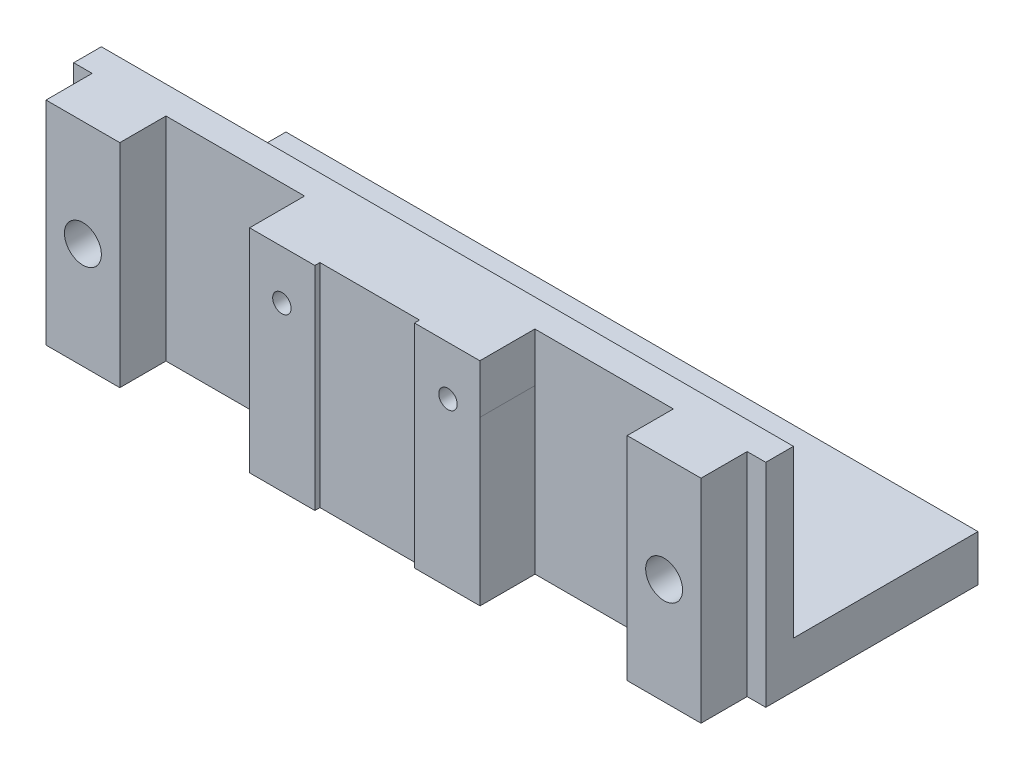
ISO-10303-21;
HEADER;
FILE_DESCRIPTION(('STEP AP214'),'2;1');
FILE_NAME('part.step','',(''),(''),'','','');
FILE_SCHEMA(('AUTOMOTIVE_DESIGN { 1 0 10303 214 1 1 1 1 }'));
ENDSEC;
DATA;
#1=APPLICATION_CONTEXT('core data for automotive mechanical design processes');
#2=APPLICATION_PROTOCOL_DEFINITION('international standard','automotive_design',2000,#1);
#3=PRODUCT_CONTEXT('',#1,'mechanical');
#4=PRODUCT('Part','Part','',(#3));
#5=PRODUCT_RELATED_PRODUCT_CATEGORY('part','',(#4));
#6=PRODUCT_DEFINITION_FORMATION('','',#4);
#7=PRODUCT_DEFINITION_CONTEXT('part definition',#1,'design');
#8=PRODUCT_DEFINITION('design','',#6,#7);
#9=PRODUCT_DEFINITION_SHAPE('','',#8);
#10=(LENGTH_UNIT() NAMED_UNIT(*) SI_UNIT(.MILLI.,.METRE.));
#11=(NAMED_UNIT(*) PLANE_ANGLE_UNIT() SI_UNIT($,.RADIAN.));
#12=(NAMED_UNIT(*) SI_UNIT($,.STERADIAN.) SOLID_ANGLE_UNIT());
#13=UNCERTAINTY_MEASURE_WITH_UNIT(LENGTH_MEASURE(1.E-05),#10,'distance_accuracy_value','');
#14=(GEOMETRIC_REPRESENTATION_CONTEXT(3) GLOBAL_UNCERTAINTY_ASSIGNED_CONTEXT((#13)) GLOBAL_UNIT_ASSIGNED_CONTEXT((#10,
#11,#12)) REPRESENTATION_CONTEXT('',''));
#15=CARTESIAN_POINT('',(0.,0.,0.));
#16=DIRECTION('',(0.,0.,1.));
#17=DIRECTION('',(1.,0.,0.));
#18=AXIS2_PLACEMENT_3D('',#15,#16,#17);
#19=CARTESIAN_POINT('',(-25.,23.,8.5));
#20=DIRECTION('',(0.,0.,1.));
#21=DIRECTION('',(1.,0.,0.));
#22=AXIS2_PLACEMENT_3D('',#19,#20,#21);
#23=PLANE('',#22);
#24=CARTESIAN_POINT('',(-19.,11.5,8.5));
#25=DIRECTION('',(0.,0.,1.));
#26=DIRECTION('',(1.,0.,0.));
#27=AXIS2_PLACEMENT_3D('',#24,#25,#26);
#28=CIRCLE('',#27,2.);
#29=CARTESIAN_POINT('',(-17.,11.5,8.5));
#30=VERTEX_POINT('',#29);
#31=EDGE_CURVE('E506',#30,#30,#28,.T.);
#32=ORIENTED_EDGE('',*,*,#31,.T.);
#33=EDGE_LOOP('',(#32));
#34=FACE_BOUND('',#33,.T.);
#35=CARTESIAN_POINT('',(3.5227918511615,17.6839423341899,8.5));
#36=DIRECTION('',(0.,0.,1.));
#37=DIRECTION('',(1.,0.,0.));
#38=AXIS2_PLACEMENT_3D('',#35,#36,#37);
#39=CIRCLE('',#38,1.);
#40=CARTESIAN_POINT('',(4.5227918511615,17.6839423341899,8.5));
#41=VERTEX_POINT('',#40);
#42=EDGE_CURVE('E255',#41,#41,#39,.T.);
#43=ORIENTED_EDGE('',*,*,#42,.T.);
#44=EDGE_LOOP('',(#43));
#45=FACE_BOUND('',#44,.T.);
#46=CARTESIAN_POINT('',(21.5227918511615,17.6839423341899,8.5));
#47=DIRECTION('',(0.,0.,1.));
#48=DIRECTION('',(1.,0.,0.));
#49=AXIS2_PLACEMENT_3D('',#46,#47,#48);
#50=CIRCLE('',#49,1.);
#51=CARTESIAN_POINT('',(22.5227918511615,17.6839423341899,8.5));
#52=VERTEX_POINT('',#51);
#53=EDGE_CURVE('E251',#52,#52,#50,.T.);
#54=ORIENTED_EDGE('',*,*,#53,.T.);
#55=EDGE_LOOP('',(#54));
#56=FACE_BOUND('',#55,.T.);
#57=DIRECTION('',(0.,1.,0.));
#58=VECTOR('',#57,1.);
#59=CARTESIAN_POINT('',(50.,23.,8.5));
#60=LINE('',#59,#58);
#61=CARTESIAN_POINT('',(50.,5.,8.5));
#62=VERTEX_POINT('',#61);
#63=CARTESIAN_POINT('',(50.,23.,8.5));
#64=VERTEX_POINT('',#63);
#65=EDGE_CURVE('E227',#62,#64,#60,.T.);
#66=ORIENTED_EDGE('',*,*,#65,.F.);
#67=DIRECTION('',(1.,0.,0.));
#68=VECTOR('',#67,1.);
#69=CARTESIAN_POINT('',(-25.,5.,8.5));
#70=LINE('',#69,#68);
#71=CARTESIAN_POINT('',(-25.,5.,8.5));
#72=VERTEX_POINT('',#71);
#73=EDGE_CURVE('E213',#72,#62,#70,.T.);
#74=ORIENTED_EDGE('',*,*,#73,.F.);
#75=DIRECTION('',(0.,-1.,0.));
#76=VECTOR('',#75,1.);
#77=CARTESIAN_POINT('',(-25.,23.,8.5));
#78=LINE('',#77,#76);
#79=CARTESIAN_POINT('',(-25.,23.,8.5));
#80=VERTEX_POINT('',#79);
#81=EDGE_CURVE('E225',#80,#72,#78,.T.);
#82=ORIENTED_EDGE('',*,*,#81,.F.);
#83=DIRECTION('',(-1.,0.,0.));
#84=VECTOR('',#83,1.);
#85=CARTESIAN_POINT('',(-25.,23.,8.5));
#86=LINE('',#85,#84);
#87=EDGE_CURVE('E234',#64,#80,#86,.T.);
#88=ORIENTED_EDGE('',*,*,#87,.F.);
#89=EDGE_LOOP('',(#66,#74,#82,#88));
#90=FACE_BOUND('',#89,.T.);
#91=CARTESIAN_POINT('',(43.9847080927789,11.4972593518539,8.5));
#92=DIRECTION('',(0.,0.,1.));
#93=DIRECTION('',(1.,0.,0.));
#94=AXIS2_PLACEMENT_3D('',#91,#92,#93);
#95=CIRCLE('',#94,2.00000000000001);
#96=CARTESIAN_POINT('',(45.9847080927789,11.4972593518539,8.5));
#97=VERTEX_POINT('',#96);
#98=EDGE_CURVE('E485',#97,#97,#95,.F.);
#99=ORIENTED_EDGE('',*,*,#98,.F.);
#100=EDGE_LOOP('',(#99));
#101=FACE_BOUND('',#100,.T.);
#102=ADVANCED_FACE('F45',(#34,#45,#56,#90,#101),#23,.F.);
#103=CARTESIAN_POINT('',(0.,0.,0.));
#104=DIRECTION('',(0.,-1.,0.));
#105=DIRECTION('',(0.,0.,-1.));
#106=AXIS2_PLACEMENT_3D('',#103,#104,#105);
#107=PLANE('',#106);
#108=CARTESIAN_POINT('',(12.5,0.,-1.06931177623776));
#109=DIRECTION('',(0.,-1.,0.));
#110=DIRECTION('',(0.,0.,-1.));
#111=AXIS2_PLACEMENT_3D('',#108,#109,#110);
#112=CIRCLE('',#111,4.);
#113=CARTESIAN_POINT('',(12.5,0.,-5.06931177623776));
#114=VERTEX_POINT('',#113);
#115=EDGE_CURVE('E492',#114,#114,#112,.T.);
#116=ORIENTED_EDGE('',*,*,#115,.F.);
#117=EDGE_LOOP('',(#116));
#118=FACE_BOUND('',#117,.T.);
#119=DIRECTION('',(0.,0.,-1.));
#120=VECTOR('',#119,1.);
#121=CARTESIAN_POINT('',(17.8908476144119,0.,16.909013180129));
#122=LINE('',#121,#120);
#123=CARTESIAN_POINT('',(17.8908476144119,0.,17.46));
#124=VERTEX_POINT('',#123);
#125=CARTESIAN_POINT('',(17.8908476144119,0.,16.909013180129));
#126=VERTEX_POINT('',#125);
#127=EDGE_CURVE('E411',#124,#126,#122,.T.);
#128=ORIENTED_EDGE('',*,*,#127,.T.);
#129=DIRECTION('',(-1.,0.,0.));
#130=VECTOR('',#129,1.);
#131=CARTESIAN_POINT('',(15.8928598006247,0.,16.9090131801291));
#132=LINE('',#131,#130);
#133=CARTESIAN_POINT('',(7.09285980061332,0.,16.909013180129));
#134=VERTEX_POINT('',#133);
#135=EDGE_CURVE('E419',#126,#134,#132,.T.);
#136=ORIENTED_EDGE('',*,*,#135,.T.);
#137=DIRECTION('',(0.,0.,1.));
#138=VECTOR('',#137,1.);
#139=CARTESIAN_POINT('',(7.09285980061332,0.,16.909013180129));
#140=LINE('',#139,#138);
#141=CARTESIAN_POINT('',(7.09285980061332,0.,17.46));
#142=VERTEX_POINT('',#141);
#143=EDGE_CURVE('E425',#134,#142,#140,.T.);
#144=ORIENTED_EDGE('',*,*,#143,.T.);
#145=DIRECTION('',(1.,0.,0.));
#146=VECTOR('',#145,1.);
#147=CARTESIAN_POINT('',(0.,0.,17.46));
#148=LINE('',#147,#146);
#149=CARTESIAN_POINT('',(0.,0.,17.46));
#150=VERTEX_POINT('',#149);
#151=EDGE_CURVE('E399',#150,#142,#148,.T.);
#152=ORIENTED_EDGE('',*,*,#151,.F.);
#153=DIRECTION('',(0.,0.,-1.));
#154=VECTOR('',#153,1.);
#155=CARTESIAN_POINT('',(0.,0.,17.46));
#156=LINE('',#155,#154);
#157=CARTESIAN_POINT('',(0.,0.,11.5));
#158=VERTEX_POINT('',#157);
#159=EDGE_CURVE('E362',#150,#158,#156,.T.);
#160=ORIENTED_EDGE('',*,*,#159,.T.);
#161=DIRECTION('',(1.,0.,0.));
#162=VECTOR('',#161,1.);
#163=CARTESIAN_POINT('',(-25.,0.,11.5));
#164=LINE('',#163,#162);
#165=CARTESIAN_POINT('',(-15.,0.,11.5));
#166=VERTEX_POINT('',#165);
#167=EDGE_CURVE('E247',#166,#158,#164,.T.);
#168=ORIENTED_EDGE('',*,*,#167,.F.);
#169=DIRECTION('',(0.,0.,-1.));
#170=VECTOR('',#169,1.);
#171=CARTESIAN_POINT('',(-15.,0.,16.5));
#172=LINE('',#171,#170);
#173=CARTESIAN_POINT('',(-15.,0.,16.5));
#174=VERTEX_POINT('',#173);
#175=EDGE_CURVE('E463',#174,#166,#172,.T.);
#176=ORIENTED_EDGE('',*,*,#175,.F.);
#177=DIRECTION('',(1.,0.,0.));
#178=VECTOR('',#177,1.);
#179=CARTESIAN_POINT('',(-23.,0.,16.5));
#180=LINE('',#179,#178);
#181=CARTESIAN_POINT('',(-23.,0.,16.5));
#182=VERTEX_POINT('',#181);
#183=EDGE_CURVE('E472',#182,#174,#180,.T.);
#184=ORIENTED_EDGE('',*,*,#183,.F.);
#185=DIRECTION('',(0.,0.,-1.));
#186=VECTOR('',#185,1.);
#187=CARTESIAN_POINT('',(-23.,0.,16.5));
#188=LINE('',#187,#186);
#189=CARTESIAN_POINT('',(-23.,0.,11.5));
#190=VERTEX_POINT('',#189);
#191=EDGE_CURVE('E334',#182,#190,#188,.T.);
#192=ORIENTED_EDGE('',*,*,#191,.T.);
#193=CARTESIAN_POINT('',(-25.,0.,11.5));
#194=VERTEX_POINT('',#193);
#195=EDGE_CURVE('E244',#194,#190,#164,.T.);
#196=ORIENTED_EDGE('',*,*,#195,.F.);
#197=DIRECTION('',(0.,0.,1.));
#198=VECTOR('',#197,1.);
#199=CARTESIAN_POINT('',(-25.,0.,11.5));
#200=LINE('',#199,#198);
#201=CARTESIAN_POINT('',(-25.,0.,-11.5));
#202=VERTEX_POINT('',#201);
#203=EDGE_CURVE('E236',#202,#194,#200,.T.);
#204=ORIENTED_EDGE('',*,*,#203,.F.);
#205=DIRECTION('',(-1.,0.,0.));
#206=VECTOR('',#205,1.);
#207=CARTESIAN_POINT('',(-25.,0.,-11.5));
#208=LINE('',#207,#206);
#209=CARTESIAN_POINT('',(50.,0.,-11.5));
#210=VERTEX_POINT('',#209);
#211=EDGE_CURVE('E233',#210,#202,#208,.T.);
#212=ORIENTED_EDGE('',*,*,#211,.F.);
#213=DIRECTION('',(0.,0.,-1.));
#214=VECTOR('',#213,1.);
#215=CARTESIAN_POINT('',(50.,0.,-11.5));
#216=LINE('',#215,#214);
#217=CARTESIAN_POINT('',(50.,0.,11.5));
#218=VERTEX_POINT('',#217);
#219=EDGE_CURVE('E354',#218,#210,#216,.T.);
#220=ORIENTED_EDGE('',*,*,#219,.F.);
#221=CARTESIAN_POINT('',(47.9837074150253,0.,11.5));
#222=VERTEX_POINT('',#221);
#223=EDGE_CURVE('E243',#222,#218,#164,.T.);
#224=ORIENTED_EDGE('',*,*,#223,.F.);
#225=DIRECTION('',(0.,0.,-1.));
#226=VECTOR('',#225,1.);
#227=CARTESIAN_POINT('',(47.9837074150253,0.,16.5));
#228=LINE('',#227,#226);
#229=CARTESIAN_POINT('',(47.9837074150253,0.,16.5));
#230=VERTEX_POINT('',#229);
#231=EDGE_CURVE('E456',#230,#222,#228,.T.);
#232=ORIENTED_EDGE('',*,*,#231,.F.);
#233=DIRECTION('',(1.,0.,0.));
#234=VECTOR('',#233,1.);
#235=CARTESIAN_POINT('',(47.9837074150253,0.,16.5));
#236=LINE('',#235,#234);
#237=CARTESIAN_POINT('',(39.9837074150253,0.,16.5));
#238=VERTEX_POINT('',#237);
#239=EDGE_CURVE('E443',#238,#230,#236,.T.);
#240=ORIENTED_EDGE('',*,*,#239,.F.);
#241=DIRECTION('',(0.,0.,-1.));
#242=VECTOR('',#241,1.);
#243=CARTESIAN_POINT('',(39.9837074150253,0.,16.5));
#244=LINE('',#243,#242);
#245=CARTESIAN_POINT('',(39.9837074150253,0.,11.5));
#246=VERTEX_POINT('',#245);
#247=EDGE_CURVE('E458',#238,#246,#244,.T.);
#248=ORIENTED_EDGE('',*,*,#247,.T.);
#249=CARTESIAN_POINT('',(25.,0.,11.5));
#250=VERTEX_POINT('',#249);
#251=EDGE_CURVE('E248',#250,#246,#164,.T.);
#252=ORIENTED_EDGE('',*,*,#251,.F.);
#253=DIRECTION('',(0.,0.,-1.));
#254=VECTOR('',#253,1.);
#255=CARTESIAN_POINT('',(25.,0.,17.46));
#256=LINE('',#255,#254);
#257=CARTESIAN_POINT('',(25.,0.,17.46));
#258=VERTEX_POINT('',#257);
#259=EDGE_CURVE('E365',#258,#250,#256,.T.);
#260=ORIENTED_EDGE('',*,*,#259,.F.);
#261=EDGE_CURVE('E402',#124,#258,#148,.T.);
#262=ORIENTED_EDGE('',*,*,#261,.F.);
#263=EDGE_LOOP('',(#128,#136,#144,#152,#160,#168,#176,#184,#192,#196,#204,#212,#220,#224,#232,
#240,#248,#252,#260,#262));
#264=FACE_BOUND('',#263,.T.);
#265=CARTESIAN_POINT('',(32.5,0.,-1.06931177623776));
#266=DIRECTION('',(0.,-1.,0.));
#267=DIRECTION('',(0.,0.,-1.));
#268=AXIS2_PLACEMENT_3D('',#265,#266,#267);
#269=CIRCLE('',#268,4.);
#270=CARTESIAN_POINT('',(32.5,0.,-5.06931177623776));
#271=VERTEX_POINT('',#270);
#272=EDGE_CURVE('E481',#271,#271,#269,.T.);
#273=ORIENTED_EDGE('',*,*,#272,.F.);
#274=EDGE_LOOP('',(#273));
#275=FACE_BOUND('',#274,.T.);
#276=CARTESIAN_POINT('',(-7.49999999999991,0.,-1.06931177623776));
#277=DIRECTION('',(0.,-1.,0.));
#278=DIRECTION('',(0.,0.,-1.));
#279=AXIS2_PLACEMENT_3D('',#276,#277,#278);
#280=CIRCLE('',#279,4.);
#281=CARTESIAN_POINT('',(-7.49999999999991,0.,-5.06931177623776));
#282=VERTEX_POINT('',#281);
#283=EDGE_CURVE('E497',#282,#282,#280,.T.);
#284=ORIENTED_EDGE('',*,*,#283,.F.);
#285=EDGE_LOOP('',(#284));
#286=FACE_BOUND('',#285,.T.);
#287=ADVANCED_FACE('F291',(#118,#264,#275,#286),#107,.T.);
#288=CARTESIAN_POINT('',(-25.,3.,11.5));
#289=DIRECTION('',(0.,0.,-1.));
#290=DIRECTION('',(-1.,0.,0.));
#291=AXIS2_PLACEMENT_3D('',#288,#289,#290);
#292=PLANE('',#291);
#293=DIRECTION('',(0.,-1.,0.));
#294=VECTOR('',#293,1.);
#295=CARTESIAN_POINT('',(39.9837074150253,0.,11.5));
#296=LINE('',#295,#294);
#297=CARTESIAN_POINT('',(39.9837074150253,23.,11.5));
#298=VERTEX_POINT('',#297);
#299=EDGE_CURVE('E450',#298,#246,#296,.T.);
#300=ORIENTED_EDGE('',*,*,#299,.F.);
#301=DIRECTION('',(1.,0.,0.));
#302=VECTOR('',#301,1.);
#303=CARTESIAN_POINT('',(-25.,23.,11.5));
#304=LINE('',#303,#302);
#305=CARTESIAN_POINT('',(24.9772081488389,23.,11.5));
#306=VERTEX_POINT('',#305);
#307=EDGE_CURVE('E343',#306,#298,#304,.T.);
#308=ORIENTED_EDGE('',*,*,#307,.F.);
#309=DIRECTION('',(0.,1.,0.));
#310=VECTOR('',#309,1.);
#311=CARTESIAN_POINT('',(24.9772081488389,17.6839423341899,11.5));
#312=LINE('',#311,#310);
#313=CARTESIAN_POINT('',(24.9772081488389,17.6839423341899,11.5));
#314=VERTEX_POINT('',#313);
#315=EDGE_CURVE('E378',#314,#306,#312,.T.);
#316=ORIENTED_EDGE('',*,*,#315,.F.);
#317=DIRECTION('',(-0.00128884339251954,0.99999916944101,0.));
#318=VECTOR('',#317,1.);
#319=CARTESIAN_POINT('',(24.9772081488389,17.6839423341899,11.5));
#320=LINE('',#319,#318);
#321=EDGE_CURVE('E382',#250,#314,#320,.T.);
#322=ORIENTED_EDGE('',*,*,#321,.F.);
#323=ORIENTED_EDGE('',*,*,#251,.T.);
#324=EDGE_LOOP('',(#300,#308,#316,#322,#323));
#325=FACE_BOUND('',#324,.T.);
#326=ADVANCED_FACE('F299',(#325),#292,.F.);
#327=DIRECTION('',(0.,1.,0.));
#328=VECTOR('',#327,1.);
#329=CARTESIAN_POINT('',(47.9837074150253,23.,11.5));
#330=LINE('',#329,#328);
#331=CARTESIAN_POINT('',(47.9837074150253,23.,11.5));
#332=VERTEX_POINT('',#331);
#333=EDGE_CURVE('E442',#222,#332,#330,.T.);
#334=ORIENTED_EDGE('',*,*,#333,.F.);
#335=ORIENTED_EDGE('',*,*,#223,.T.);
#336=DIRECTION('',(0.,-1.,0.));
#337=VECTOR('',#336,1.);
#338=CARTESIAN_POINT('',(50.,0.,11.5));
#339=LINE('',#338,#337);
#340=CARTESIAN_POINT('',(50.,23.,11.5));
#341=VERTEX_POINT('',#340);
#342=EDGE_CURVE('E356',#341,#218,#339,.T.);
#343=ORIENTED_EDGE('',*,*,#342,.F.);
#344=EDGE_CURVE('E346',#332,#341,#304,.T.);
#345=ORIENTED_EDGE('',*,*,#344,.F.);
#346=EDGE_LOOP('',(#334,#335,#343,#345));
#347=FACE_BOUND('',#346,.T.);
#348=ADVANCED_FACE('F307',(#347),#292,.F.);
#349=DIRECTION('',(0.,-1.,0.));
#350=VECTOR('',#349,1.);
#351=CARTESIAN_POINT('',(-23.,23.,11.5));
#352=LINE('',#351,#350);
#353=CARTESIAN_POINT('',(-23.,23.,11.5));
#354=VERTEX_POINT('',#353);
#355=EDGE_CURVE('E339',#354,#190,#352,.T.);
#356=ORIENTED_EDGE('',*,*,#355,.F.);
#357=CARTESIAN_POINT('',(-25.,23.,11.5));
#358=VERTEX_POINT('',#357);
#359=EDGE_CURVE('E238',#358,#354,#304,.T.);
#360=ORIENTED_EDGE('',*,*,#359,.F.);
#361=DIRECTION('',(0.,-1.,0.));
#362=VECTOR('',#361,1.);
#363=CARTESIAN_POINT('',(-25.,3.,11.5));
#364=LINE('',#363,#362);
#365=EDGE_CURVE('E54',#358,#194,#364,.T.);
#366=ORIENTED_EDGE('',*,*,#365,.T.);
#367=ORIENTED_EDGE('',*,*,#195,.T.);
#368=EDGE_LOOP('',(#356,#360,#366,#367));
#369=FACE_BOUND('',#368,.T.);
#370=ADVANCED_FACE('F337',(#369),#292,.F.);
#371=DIRECTION('',(0.,1.,0.));
#372=VECTOR('',#371,1.);
#373=CARTESIAN_POINT('',(-15.,0.,11.5));
#374=LINE('',#373,#372);
#375=CARTESIAN_POINT('',(-15.,23.,11.5));
#376=VERTEX_POINT('',#375);
#377=EDGE_CURVE('E467',#166,#376,#374,.T.);
#378=ORIENTED_EDGE('',*,*,#377,.F.);
#379=ORIENTED_EDGE('',*,*,#167,.T.);
#380=DIRECTION('',(-0.00128884339251915,-0.99999916944101,0.));
#381=VECTOR('',#380,1.);
#382=CARTESIAN_POINT('',(0.0227918511610872,17.6839423341898,11.5));
#383=LINE('',#382,#381);
#384=CARTESIAN_POINT('',(0.0227918511610872,17.6839423341898,11.5));
#385=VERTEX_POINT('',#384);
#386=EDGE_CURVE('E385',#385,#158,#383,.T.);
#387=ORIENTED_EDGE('',*,*,#386,.F.);
#388=DIRECTION('',(0.,-1.,0.));
#389=VECTOR('',#388,1.);
#390=CARTESIAN_POINT('',(0.0227918511610872,17.6839423341898,11.5));
#391=LINE('',#390,#389);
#392=CARTESIAN_POINT('',(0.0227918511610907,23.,11.5));
#393=VERTEX_POINT('',#392);
#394=EDGE_CURVE('E388',#393,#385,#391,.T.);
#395=ORIENTED_EDGE('',*,*,#394,.F.);
#396=EDGE_CURVE('E342',#376,#393,#304,.T.);
#397=ORIENTED_EDGE('',*,*,#396,.F.);
#398=EDGE_LOOP('',(#378,#379,#387,#395,#397));
#399=FACE_BOUND('',#398,.T.);
#400=ADVANCED_FACE('F309',(#399),#292,.F.);
#401=CARTESIAN_POINT('',(0.,0.,17.46));
#402=DIRECTION('',(0.,0.,-1.));
#403=DIRECTION('',(-1.,0.,0.));
#404=AXIS2_PLACEMENT_3D('',#401,#402,#403);
#405=PLANE('',#404);
#406=CARTESIAN_POINT('',(21.5227918511615,17.6839423341899,17.46));
#407=DIRECTION('',(0.,0.,1.));
#408=DIRECTION('',(1.,0.,0.));
#409=AXIS2_PLACEMENT_3D('',#406,#407,#408);
#410=CIRCLE('',#409,1.);
#411=CARTESIAN_POINT('',(22.5227918511615,17.6839423341899,17.46));
#412=VERTEX_POINT('',#411);
#413=EDGE_CURVE('E433',#412,#412,#410,.T.);
#414=ORIENTED_EDGE('',*,*,#413,.F.);
#415=EDGE_LOOP('',(#414));
#416=FACE_BOUND('',#415,.T.);
#417=DIRECTION('',(-1.,0.,0.));
#418=VECTOR('',#417,1.);
#419=CARTESIAN_POINT('',(0.0227918511610942,23.,17.46));
#420=LINE('',#419,#418);
#421=CARTESIAN_POINT('',(24.9772081488389,23.,17.46));
#422=VERTEX_POINT('',#421);
#423=CARTESIAN_POINT('',(17.8908476144119,23.,17.46));
#424=VERTEX_POINT('',#423);
#425=EDGE_CURVE('E377',#422,#424,#420,.T.);
#426=ORIENTED_EDGE('',*,*,#425,.T.);
#427=DIRECTION('',(0.,1.,0.));
#428=VECTOR('',#427,1.);
#429=CARTESIAN_POINT('',(17.8908476144119,0.,17.46));
#430=LINE('',#429,#428);
#431=EDGE_CURVE('E414',#124,#424,#430,.T.);
#432=ORIENTED_EDGE('',*,*,#431,.F.);
#433=ORIENTED_EDGE('',*,*,#261,.T.);
#434=DIRECTION('',(-0.00128884339251954,0.99999916944101,0.));
#435=VECTOR('',#434,1.);
#436=CARTESIAN_POINT('',(24.9772081488389,17.6839423341899,17.46));
#437=LINE('',#436,#435);
#438=CARTESIAN_POINT('',(24.9772081488389,17.6839423341899,17.46));
#439=VERTEX_POINT('',#438);
#440=EDGE_CURVE('E397',#258,#439,#437,.T.);
#441=ORIENTED_EDGE('',*,*,#440,.T.);
#442=DIRECTION('',(0.,1.,0.));
#443=VECTOR('',#442,1.);
#444=CARTESIAN_POINT('',(24.9772081488389,17.6839423341899,17.46));
#445=LINE('',#444,#443);
#446=EDGE_CURVE('E395',#439,#422,#445,.T.);
#447=ORIENTED_EDGE('',*,*,#446,.T.);
#448=EDGE_LOOP('',(#426,#432,#433,#441,#447));
#449=FACE_BOUND('',#448,.T.);
#450=ADVANCED_FACE('F314',(#416,#449),#405,.F.);
#451=CARTESIAN_POINT('',(-25.,3.,-11.5));
#452=DIRECTION('',(0.,0.,1.));
#453=DIRECTION('',(1.,0.,0.));
#454=AXIS2_PLACEMENT_3D('',#451,#452,#453);
#455=PLANE('',#454);
#456=ORIENTED_EDGE('',*,*,#211,.T.);
#457=DIRECTION('',(0.,-1.,0.));
#458=VECTOR('',#457,1.);
#459=CARTESIAN_POINT('',(-25.,3.,-11.5));
#460=LINE('',#459,#458);
#461=CARTESIAN_POINT('',(-25.,5.,-11.5));
#462=VERTEX_POINT('',#461);
#463=EDGE_CURVE('E11',#462,#202,#460,.T.);
#464=ORIENTED_EDGE('',*,*,#463,.F.);
#465=DIRECTION('',(-1.,0.,0.));
#466=VECTOR('',#465,1.);
#467=CARTESIAN_POINT('',(-25.,5.,-11.5));
#468=LINE('',#467,#466);
#469=CARTESIAN_POINT('',(50.,5.,-11.5));
#470=VERTEX_POINT('',#469);
#471=EDGE_CURVE('E216',#470,#462,#468,.T.);
#472=ORIENTED_EDGE('',*,*,#471,.F.);
#473=DIRECTION('',(0.,1.,0.));
#474=VECTOR('',#473,1.);
#475=CARTESIAN_POINT('',(50.,3.,-11.5));
#476=LINE('',#475,#474);
#477=EDGE_CURVE('E323',#210,#470,#476,.T.);
#478=ORIENTED_EDGE('',*,*,#477,.F.);
#479=EDGE_LOOP('',(#456,#464,#472,#478));
#480=FACE_BOUND('',#479,.T.);
#481=ADVANCED_FACE('F47',(#480),#455,.F.);
#482=CARTESIAN_POINT('',(-25.,3.,11.5));
#483=DIRECTION('',(1.,0.,0.));
#484=DIRECTION('',(0.,0.,-1.));
#485=AXIS2_PLACEMENT_3D('',#482,#483,#484);
#486=PLANE('',#485);
#487=ORIENTED_EDGE('',*,*,#203,.T.);
#488=ORIENTED_EDGE('',*,*,#365,.F.);
#489=DIRECTION('',(0.,0.,1.));
#490=VECTOR('',#489,1.);
#491=CARTESIAN_POINT('',(-25.,23.,11.5));
#492=LINE('',#491,#490);
#493=EDGE_CURVE('E232',#80,#358,#492,.T.);
#494=ORIENTED_EDGE('',*,*,#493,.F.);
#495=ORIENTED_EDGE('',*,*,#81,.T.);
#496=DIRECTION('',(0.,0.,1.));
#497=VECTOR('',#496,1.);
#498=CARTESIAN_POINT('',(-25.,5.,-11.5));
#499=LINE('',#498,#497);
#500=EDGE_CURVE('E209',#462,#72,#499,.T.);
#501=ORIENTED_EDGE('',*,*,#500,.F.);
#502=ORIENTED_EDGE('',*,*,#463,.T.);
#503=EDGE_LOOP('',(#487,#488,#494,#495,#501,#502));
#504=FACE_BOUND('',#503,.T.);
#505=ADVANCED_FACE('F230',(#504),#486,.F.);
#506=CARTESIAN_POINT('',(0.,23.,0.));
#507=DIRECTION('',(0.,-1.,0.));
#508=DIRECTION('',(0.,0.,-1.));
#509=AXIS2_PLACEMENT_3D('',#506,#507,#508);
#510=PLANE('',#509);
#511=DIRECTION('',(-1.,0.,0.));
#512=VECTOR('',#511,1.);
#513=CARTESIAN_POINT('',(15.8928598006247,23.,16.9090131801291));
#514=LINE('',#513,#512);
#515=CARTESIAN_POINT('',(17.8908476144119,23.,16.909013180129));
#516=VERTEX_POINT('',#515);
#517=CARTESIAN_POINT('',(7.09285980061332,23.,16.909013180129));
#518=VERTEX_POINT('',#517);
#519=EDGE_CURVE('E417',#516,#518,#514,.T.);
#520=ORIENTED_EDGE('',*,*,#519,.F.);
#521=DIRECTION('',(0.,0.,-1.));
#522=VECTOR('',#521,1.);
#523=CARTESIAN_POINT('',(17.8908476144119,23.,16.909013180129));
#524=LINE('',#523,#522);
#525=EDGE_CURVE('E420',#424,#516,#524,.T.);
#526=ORIENTED_EDGE('',*,*,#525,.F.);
#527=ORIENTED_EDGE('',*,*,#425,.F.);
#528=DIRECTION('',(0.,0.,-1.));
#529=VECTOR('',#528,1.);
#530=CARTESIAN_POINT('',(24.9772081488389,23.,17.46));
#531=LINE('',#530,#529);
#532=EDGE_CURVE('E371',#422,#306,#531,.T.);
#533=ORIENTED_EDGE('',*,*,#532,.T.);
#534=ORIENTED_EDGE('',*,*,#307,.T.);
#535=DIRECTION('',(0.,0.,-1.));
#536=VECTOR('',#535,1.);
#537=CARTESIAN_POINT('',(39.9837074150253,23.,16.5));
#538=LINE('',#537,#536);
#539=CARTESIAN_POINT('',(39.9837074150253,23.,16.5));
#540=VERTEX_POINT('',#539);
#541=EDGE_CURVE('E449',#540,#298,#538,.T.);
#542=ORIENTED_EDGE('',*,*,#541,.F.);
#543=DIRECTION('',(-1.,0.,0.));
#544=VECTOR('',#543,1.);
#545=CARTESIAN_POINT('',(39.9837074150253,23.,16.5));
#546=LINE('',#545,#544);
#547=CARTESIAN_POINT('',(47.9837074150253,23.,16.5));
#548=VERTEX_POINT('',#547);
#549=EDGE_CURVE('E447',#548,#540,#546,.T.);
#550=ORIENTED_EDGE('',*,*,#549,.F.);
#551=DIRECTION('',(0.,0.,-1.));
#552=VECTOR('',#551,1.);
#553=CARTESIAN_POINT('',(47.9837074150253,23.,16.5));
#554=LINE('',#553,#552);
#555=EDGE_CURVE('E69',#548,#332,#554,.T.);
#556=ORIENTED_EDGE('',*,*,#555,.T.);
#557=ORIENTED_EDGE('',*,*,#344,.T.);
#558=DIRECTION('',(0.,0.,1.));
#559=VECTOR('',#558,1.);
#560=CARTESIAN_POINT('',(50.,23.,11.5));
#561=LINE('',#560,#559);
#562=EDGE_CURVE('E347',#64,#341,#561,.T.);
#563=ORIENTED_EDGE('',*,*,#562,.F.);
#564=ORIENTED_EDGE('',*,*,#87,.T.);
#565=ORIENTED_EDGE('',*,*,#493,.T.);
#566=ORIENTED_EDGE('',*,*,#359,.T.);
#567=DIRECTION('',(0.,0.,-1.));
#568=VECTOR('',#567,1.);
#569=CARTESIAN_POINT('',(-23.,23.,16.5));
#570=LINE('',#569,#568);
#571=CARTESIAN_POINT('',(-23.,23.,16.5));
#572=VERTEX_POINT('',#571);
#573=EDGE_CURVE('E436',#572,#354,#570,.T.);
#574=ORIENTED_EDGE('',*,*,#573,.F.);
#575=DIRECTION('',(-1.,0.,0.));
#576=VECTOR('',#575,1.);
#577=CARTESIAN_POINT('',(-15.,23.,16.5));
#578=LINE('',#577,#576);
#579=CARTESIAN_POINT('',(-15.,23.,16.5));
#580=VERTEX_POINT('',#579);
#581=EDGE_CURVE('E469',#580,#572,#578,.T.);
#582=ORIENTED_EDGE('',*,*,#581,.F.);
#583=DIRECTION('',(0.,0.,-1.));
#584=VECTOR('',#583,1.);
#585=CARTESIAN_POINT('',(-15.,23.,16.5));
#586=LINE('',#585,#584);
#587=EDGE_CURVE('E62',#580,#376,#586,.T.);
#588=ORIENTED_EDGE('',*,*,#587,.T.);
#589=ORIENTED_EDGE('',*,*,#396,.T.);
#590=DIRECTION('',(0.,0.,-1.));
#591=VECTOR('',#590,1.);
#592=CARTESIAN_POINT('',(0.0227918511610942,23.,17.46));
#593=LINE('',#592,#591);
#594=CARTESIAN_POINT('',(0.0227918511610942,23.,17.46));
#595=VERTEX_POINT('',#594);
#596=EDGE_CURVE('E374',#595,#393,#593,.T.);
#597=ORIENTED_EDGE('',*,*,#596,.F.);
#598=CARTESIAN_POINT('',(7.09285980061332,23.,17.46));
#599=VERTEX_POINT('',#598);
#600=EDGE_CURVE('E394',#599,#595,#420,.T.);
#601=ORIENTED_EDGE('',*,*,#600,.F.);
#602=DIRECTION('',(0.,0.,1.));
#603=VECTOR('',#602,1.);
#604=CARTESIAN_POINT('',(7.09285980061332,23.,16.909013180129));
#605=LINE('',#604,#603);
#606=EDGE_CURVE('E254',#518,#599,#605,.T.);
#607=ORIENTED_EDGE('',*,*,#606,.F.);
#608=EDGE_LOOP('',(#520,#526,#527,#533,#534,#542,#550,#556,#557,#563,#564,#565,#566,#574,#582,
#588,#589,#597,#601,#607));
#609=FACE_BOUND('',#608,.T.);
#610=ADVANCED_FACE('F286',(#609),#510,.F.);
#611=CARTESIAN_POINT('',(50.,0.,0.));
#612=DIRECTION('',(-1.,0.,0.));
#613=DIRECTION('',(0.,0.,1.));
#614=AXIS2_PLACEMENT_3D('',#611,#612,#613);
#615=PLANE('',#614);
#616=DIRECTION('',(0.,0.,-1.));
#617=VECTOR('',#616,1.);
#618=CARTESIAN_POINT('',(50.,5.,-11.5));
#619=LINE('',#618,#617);
#620=EDGE_CURVE('E228',#62,#470,#619,.T.);
#621=ORIENTED_EDGE('',*,*,#620,.F.);
#622=ORIENTED_EDGE('',*,*,#65,.T.);
#623=ORIENTED_EDGE('',*,*,#562,.T.);
#624=ORIENTED_EDGE('',*,*,#342,.T.);
#625=ORIENTED_EDGE('',*,*,#219,.T.);
#626=ORIENTED_EDGE('',*,*,#477,.T.);
#627=EDGE_LOOP('',(#621,#622,#623,#624,#625,#626));
#628=FACE_BOUND('',#627,.T.);
#629=ADVANCED_FACE('F277',(#628),#615,.F.);
#630=CARTESIAN_POINT('',(32.5,10.,-1.06931177623776));
#631=DIRECTION('',(0.,-1.,0.));
#632=DIRECTION('',(0.,0.,-1.));
#633=AXIS2_PLACEMENT_3D('',#630,#631,#632);
#634=CYLINDRICAL_SURFACE('',#633,3.);
#635=CARTESIAN_POINT('',(32.5,-3.,-1.06931177623776));
#636=DIRECTION('',(0.,-1.,0.));
#637=DIRECTION('',(0.,0.,-1.));
#638=AXIS2_PLACEMENT_3D('',#635,#636,#637);
#639=CIRCLE('',#638,2.99999999999999);
#640=CARTESIAN_POINT('',(32.5,-3.,-4.06931177623776));
#641=VERTEX_POINT('',#640);
#642=EDGE_CURVE('E478',#641,#641,#639,.T.);
#643=ORIENTED_EDGE('',*,*,#642,.T.);
#644=EDGE_LOOP('',(#643));
#645=FACE_BOUND('',#644,.T.);
#646=CARTESIAN_POINT('',(32.5,5.,-1.06931177623776));
#647=DIRECTION('',(0.,1.,0.));
#648=DIRECTION('',(0.,0.,1.));
#649=AXIS2_PLACEMENT_3D('',#646,#647,#648);
#650=CIRCLE('',#649,2.99999999999999);
#651=CARTESIAN_POINT('',(32.5,5.,1.93068822376223));
#652=VERTEX_POINT('',#651);
#653=EDGE_CURVE('E256',#652,#652,#650,.T.);
#654=ORIENTED_EDGE('',*,*,#653,.T.);
#655=EDGE_LOOP('',(#654));
#656=FACE_BOUND('',#655,.T.);
#657=ADVANCED_FACE('F274',(#645,#656),#634,.F.);
#658=CARTESIAN_POINT('',(12.5,10.,-1.06931177623776));
#659=DIRECTION('',(0.,-1.,0.));
#660=DIRECTION('',(0.,0.,-1.));
#661=AXIS2_PLACEMENT_3D('',#658,#659,#660);
#662=CYLINDRICAL_SURFACE('',#661,3.);
#663=CARTESIAN_POINT('',(12.5,-3.,-1.06931177623776));
#664=DIRECTION('',(0.,-1.,0.));
#665=DIRECTION('',(0.,0.,-1.));
#666=AXIS2_PLACEMENT_3D('',#663,#664,#665);
#667=CIRCLE('',#666,3.);
#668=CARTESIAN_POINT('',(12.5,-3.,-4.06931177623776));
#669=VERTEX_POINT('',#668);
#670=EDGE_CURVE('E488',#669,#669,#667,.T.);
#671=ORIENTED_EDGE('',*,*,#670,.T.);
#672=EDGE_LOOP('',(#671));
#673=FACE_BOUND('',#672,.T.);
#674=CARTESIAN_POINT('',(12.5,5.,-1.06931177623776));
#675=DIRECTION('',(0.,1.,0.));
#676=DIRECTION('',(0.,0.,1.));
#677=AXIS2_PLACEMENT_3D('',#674,#675,#676);
#678=CIRCLE('',#677,3.);
#679=CARTESIAN_POINT('',(12.5,5.,1.93068822376224));
#680=VERTEX_POINT('',#679);
#681=EDGE_CURVE('E258',#680,#680,#678,.T.);
#682=ORIENTED_EDGE('',*,*,#681,.T.);
#683=EDGE_LOOP('',(#682));
#684=FACE_BOUND('',#683,.T.);
#685=ADVANCED_FACE('F276',(#673,#684),#662,.F.);
#686=CARTESIAN_POINT('',(-7.50000000000001,10.,-1.06931177623776));
#687=DIRECTION('',(0.,-1.,0.));
#688=DIRECTION('',(0.,0.,-1.));
#689=AXIS2_PLACEMENT_3D('',#686,#687,#688);
#690=CYLINDRICAL_SURFACE('',#689,3.);
#691=CARTESIAN_POINT('',(-7.49999999999991,-3.,-1.06931177623776));
#692=DIRECTION('',(0.,-1.,0.));
#693=DIRECTION('',(0.,0.,-1.));
#694=AXIS2_PLACEMENT_3D('',#691,#692,#693);
#695=CIRCLE('',#694,2.99999999999994);
#696=CARTESIAN_POINT('',(-7.49999999999991,-3.,-4.06931177623769));
#697=VERTEX_POINT('',#696);
#698=EDGE_CURVE('E491',#697,#697,#695,.T.);
#699=ORIENTED_EDGE('',*,*,#698,.T.);
#700=EDGE_LOOP('',(#699));
#701=FACE_BOUND('',#700,.T.);
#702=CARTESIAN_POINT('',(-7.50000000000001,5.,-1.06931177623776));
#703=DIRECTION('',(0.,1.,0.));
#704=DIRECTION('',(0.,0.,1.));
#705=AXIS2_PLACEMENT_3D('',#702,#703,#704);
#706=CIRCLE('',#705,3.);
#707=CARTESIAN_POINT('',(-7.50000000000001,5.,1.93068822376224));
#708=VERTEX_POINT('',#707);
#709=EDGE_CURVE('E49',#708,#708,#706,.T.);
#710=ORIENTED_EDGE('',*,*,#709,.T.);
#711=EDGE_LOOP('',(#710));
#712=FACE_BOUND('',#711,.T.);
#713=ADVANCED_FACE('F265',(#701,#712),#690,.F.);
#714=CARTESIAN_POINT('',(0.0227918511610872,17.6839423341898,17.46));
#715=DIRECTION('',(1.,0.,0.));
#716=DIRECTION('',(0.,1.,0.));
#717=AXIS2_PLACEMENT_3D('',#714,#715,#716);
#718=PLANE('',#717);
#719=ORIENTED_EDGE('',*,*,#394,.T.);
#720=DIRECTION('',(0.,0.,-1.));
#721=VECTOR('',#720,1.);
#722=CARTESIAN_POINT('',(0.0227918511610872,17.6839423341898,17.46));
#723=LINE('',#722,#721);
#724=CARTESIAN_POINT('',(0.0227918511610872,17.6839423341898,17.46));
#725=VERTEX_POINT('',#724);
#726=EDGE_CURVE('E359',#725,#385,#723,.T.);
#727=ORIENTED_EDGE('',*,*,#726,.F.);
#728=DIRECTION('',(0.,-1.,0.));
#729=VECTOR('',#728,1.);
#730=CARTESIAN_POINT('',(0.0227918511610872,17.6839423341898,17.46));
#731=LINE('',#730,#729);
#732=EDGE_CURVE('E381',#595,#725,#731,.T.);
#733=ORIENTED_EDGE('',*,*,#732,.F.);
#734=ORIENTED_EDGE('',*,*,#596,.T.);
#735=EDGE_LOOP('',(#719,#727,#733,#734));
#736=FACE_BOUND('',#735,.T.);
#737=ADVANCED_FACE('F539',(#736),#718,.F.);
#738=CARTESIAN_POINT('',(0.0227918511610872,17.6839423341898,17.46));
#739=DIRECTION('',(0.99999916944101,-0.00128884339251915,0.));
#740=DIRECTION('',(0.00128884339251916,0.99999916944101,0.));
#741=AXIS2_PLACEMENT_3D('',#738,#739,#740);
#742=PLANE('',#741);
#743=ORIENTED_EDGE('',*,*,#386,.T.);
#744=ORIENTED_EDGE('',*,*,#159,.F.);
#745=DIRECTION('',(-0.00128884339251915,-0.99999916944101,0.));
#746=VECTOR('',#745,1.);
#747=CARTESIAN_POINT('',(0.0227918511610872,17.6839423341898,17.46));
#748=LINE('',#747,#746);
#749=EDGE_CURVE('E403',#725,#150,#748,.T.);
#750=ORIENTED_EDGE('',*,*,#749,.F.);
#751=ORIENTED_EDGE('',*,*,#726,.T.);
#752=EDGE_LOOP('',(#743,#744,#750,#751));
#753=FACE_BOUND('',#752,.T.);
#754=ADVANCED_FACE('F530',(#753),#742,.F.);
#755=CARTESIAN_POINT('',(24.9772081488389,17.6839423341899,17.46));
#756=DIRECTION('',(-0.99999916944101,-0.00128884339251954,0.));
#757=DIRECTION('',(0.00128884339251954,-0.99999916944101,0.));
#758=AXIS2_PLACEMENT_3D('',#755,#756,#757);
#759=PLANE('',#758);
#760=ORIENTED_EDGE('',*,*,#321,.T.);
#761=DIRECTION('',(0.,0.,-1.));
#762=VECTOR('',#761,1.);
#763=CARTESIAN_POINT('',(24.9772081488389,17.6839423341899,17.46));
#764=LINE('',#763,#762);
#765=EDGE_CURVE('E368',#439,#314,#764,.T.);
#766=ORIENTED_EDGE('',*,*,#765,.F.);
#767=ORIENTED_EDGE('',*,*,#440,.F.);
#768=ORIENTED_EDGE('',*,*,#259,.T.);
#769=EDGE_LOOP('',(#760,#766,#767,#768));
#770=FACE_BOUND('',#769,.T.);
#771=ADVANCED_FACE('F552',(#770),#759,.F.);
#772=CARTESIAN_POINT('',(24.9772081488389,17.6839423341899,17.46));
#773=DIRECTION('',(-1.,0.,0.));
#774=DIRECTION('',(0.,0.,1.));
#775=AXIS2_PLACEMENT_3D('',#772,#773,#774);
#776=PLANE('',#775);
#777=ORIENTED_EDGE('',*,*,#315,.T.);
#778=ORIENTED_EDGE('',*,*,#532,.F.);
#779=ORIENTED_EDGE('',*,*,#446,.F.);
#780=ORIENTED_EDGE('',*,*,#765,.T.);
#781=EDGE_LOOP('',(#777,#778,#779,#780));
#782=FACE_BOUND('',#781,.T.);
#783=ADVANCED_FACE('F547',(#782),#776,.F.);
#784=CARTESIAN_POINT('',(3.5227918511615,17.6839423341899,17.46));
#785=DIRECTION('',(0.,0.,1.));
#786=DIRECTION('',(1.,0.,0.));
#787=AXIS2_PLACEMENT_3D('',#784,#785,#786);
#788=CIRCLE('',#787,1.);
#789=CARTESIAN_POINT('',(4.5227918511615,17.6839423341899,17.46));
#790=VERTEX_POINT('',#789);
#791=EDGE_CURVE('E432',#790,#790,#788,.T.);
#792=ORIENTED_EDGE('',*,*,#791,.F.);
#793=EDGE_LOOP('',(#792));
#794=FACE_BOUND('',#793,.T.);
#795=ORIENTED_EDGE('',*,*,#151,.T.);
#796=DIRECTION('',(0.,1.,0.));
#797=VECTOR('',#796,1.);
#798=CARTESIAN_POINT('',(7.09285980061332,0.,17.46));
#799=LINE('',#798,#797);
#800=EDGE_CURVE('E410',#142,#599,#799,.T.);
#801=ORIENTED_EDGE('',*,*,#800,.T.);
#802=ORIENTED_EDGE('',*,*,#600,.T.);
#803=ORIENTED_EDGE('',*,*,#732,.T.);
#804=ORIENTED_EDGE('',*,*,#749,.T.);
#805=EDGE_LOOP('',(#795,#801,#802,#803,#804));
#806=FACE_BOUND('',#805,.T.);
#807=ADVANCED_FACE('F321',(#794,#806),#405,.F.);
#808=CARTESIAN_POINT('',(15.8928598006247,0.,16.9090131801291));
#809=DIRECTION('',(0.,0.,-1.));
#810=DIRECTION('',(-1.,0.,0.));
#811=AXIS2_PLACEMENT_3D('',#808,#809,#810);
#812=PLANE('',#811);
#813=ORIENTED_EDGE('',*,*,#519,.T.);
#814=DIRECTION('',(0.,1.,0.));
#815=VECTOR('',#814,1.);
#816=CARTESIAN_POINT('',(7.09285980061332,0.,16.909013180129));
#817=LINE('',#816,#815);
#818=EDGE_CURVE('E407',#134,#518,#817,.T.);
#819=ORIENTED_EDGE('',*,*,#818,.F.);
#820=ORIENTED_EDGE('',*,*,#135,.F.);
#821=DIRECTION('',(0.,1.,0.));
#822=VECTOR('',#821,1.);
#823=CARTESIAN_POINT('',(17.8908476144119,0.,16.909013180129));
#824=LINE('',#823,#822);
#825=EDGE_CURVE('E391',#126,#516,#824,.T.);
#826=ORIENTED_EDGE('',*,*,#825,.T.);
#827=EDGE_LOOP('',(#813,#819,#820,#826));
#828=FACE_BOUND('',#827,.T.);
#829=ADVANCED_FACE('F817',(#828),#812,.F.);
#830=CARTESIAN_POINT('',(17.8908476144119,0.,16.909013180129));
#831=DIRECTION('',(1.,0.,0.));
#832=DIRECTION('',(0.,0.,-1.));
#833=AXIS2_PLACEMENT_3D('',#830,#831,#832);
#834=PLANE('',#833);
#835=ORIENTED_EDGE('',*,*,#525,.T.);
#836=ORIENTED_EDGE('',*,*,#825,.F.);
#837=ORIENTED_EDGE('',*,*,#127,.F.);
#838=ORIENTED_EDGE('',*,*,#431,.T.);
#839=EDGE_LOOP('',(#835,#836,#837,#838));
#840=FACE_BOUND('',#839,.T.);
#841=ADVANCED_FACE('F831',(#840),#834,.F.);
#842=CARTESIAN_POINT('',(7.09285980061332,0.,16.909013180129));
#843=DIRECTION('',(-1.,0.,0.));
#844=DIRECTION('',(0.,0.,1.));
#845=AXIS2_PLACEMENT_3D('',#842,#843,#844);
#846=PLANE('',#845);
#847=ORIENTED_EDGE('',*,*,#606,.T.);
#848=ORIENTED_EDGE('',*,*,#800,.F.);
#849=ORIENTED_EDGE('',*,*,#143,.F.);
#850=ORIENTED_EDGE('',*,*,#818,.T.);
#851=EDGE_LOOP('',(#847,#848,#849,#850));
#852=FACE_BOUND('',#851,.T.);
#853=ADVANCED_FACE('F847',(#852),#846,.F.);
#854=CARTESIAN_POINT('',(3.5227918511615,17.6839423341899,-11.5));
#855=DIRECTION('',(0.,0.,1.));
#856=DIRECTION('',(1.,0.,0.));
#857=AXIS2_PLACEMENT_3D('',#854,#855,#856);
#858=CYLINDRICAL_SURFACE('',#857,1.);
#859=ORIENTED_EDGE('',*,*,#791,.T.);
#860=EDGE_LOOP('',(#859));
#861=FACE_BOUND('',#860,.T.);
#862=ORIENTED_EDGE('',*,*,#42,.F.);
#863=EDGE_LOOP('',(#862));
#864=FACE_BOUND('',#863,.T.);
#865=ADVANCED_FACE('F857',(#861,#864),#858,.F.);
#866=CARTESIAN_POINT('',(21.5227918511615,17.6839423341899,-11.5));
#867=DIRECTION('',(0.,0.,1.));
#868=DIRECTION('',(1.,0.,0.));
#869=AXIS2_PLACEMENT_3D('',#866,#867,#868);
#870=CYLINDRICAL_SURFACE('',#869,1.);
#871=ORIENTED_EDGE('',*,*,#413,.T.);
#872=EDGE_LOOP('',(#871));
#873=FACE_BOUND('',#872,.T.);
#874=ORIENTED_EDGE('',*,*,#53,.F.);
#875=EDGE_LOOP('',(#874));
#876=FACE_BOUND('',#875,.T.);
#877=ADVANCED_FACE('F586',(#873,#876),#870,.F.);
#878=CARTESIAN_POINT('',(39.9837074150253,0.,16.5));
#879=DIRECTION('',(1.,0.,0.));
#880=DIRECTION('',(0.,0.,-1.));
#881=AXIS2_PLACEMENT_3D('',#878,#879,#880);
#882=PLANE('',#881);
#883=ORIENTED_EDGE('',*,*,#299,.T.);
#884=ORIENTED_EDGE('',*,*,#247,.F.);
#885=DIRECTION('',(0.,-1.,0.));
#886=VECTOR('',#885,1.);
#887=CARTESIAN_POINT('',(39.9837074150253,0.,16.5));
#888=LINE('',#887,#886);
#889=EDGE_CURVE('E439',#540,#238,#888,.T.);
#890=ORIENTED_EDGE('',*,*,#889,.F.);
#891=ORIENTED_EDGE('',*,*,#541,.T.);
#892=EDGE_LOOP('',(#883,#884,#890,#891));
#893=FACE_BOUND('',#892,.T.);
#894=ADVANCED_FACE('F558',(#893),#882,.F.);
#895=CARTESIAN_POINT('',(47.9837074150253,23.,16.5));
#896=DIRECTION('',(-1.,0.,0.));
#897=DIRECTION('',(0.,0.,1.));
#898=AXIS2_PLACEMENT_3D('',#895,#896,#897);
#899=PLANE('',#898);
#900=ORIENTED_EDGE('',*,*,#333,.T.);
#901=ORIENTED_EDGE('',*,*,#555,.F.);
#902=DIRECTION('',(0.,1.,0.));
#903=VECTOR('',#902,1.);
#904=CARTESIAN_POINT('',(47.9837074150253,23.,16.5));
#905=LINE('',#904,#903);
#906=EDGE_CURVE('E445',#230,#548,#905,.T.);
#907=ORIENTED_EDGE('',*,*,#906,.F.);
#908=ORIENTED_EDGE('',*,*,#231,.T.);
#909=EDGE_LOOP('',(#900,#901,#907,#908));
#910=FACE_BOUND('',#909,.T.);
#911=ADVANCED_FACE('F562',(#910),#899,.F.);
#912=CARTESIAN_POINT('',(0.,0.,16.5));
#913=DIRECTION('',(0.,0.,-1.));
#914=DIRECTION('',(-1.,0.,0.));
#915=AXIS2_PLACEMENT_3D('',#912,#913,#914);
#916=PLANE('',#915);
#917=CARTESIAN_POINT('',(43.9847080927789,11.4972593518539,16.5));
#918=DIRECTION('',(0.,0.,1.));
#919=DIRECTION('',(1.,0.,0.));
#920=AXIS2_PLACEMENT_3D('',#917,#918,#919);
#921=CIRCLE('',#920,2.00000000000001);
#922=CARTESIAN_POINT('',(45.9847080927789,11.4972593518539,16.5));
#923=VERTEX_POINT('',#922);
#924=EDGE_CURVE('E508',#923,#923,#921,.F.);
#925=ORIENTED_EDGE('',*,*,#924,.T.);
#926=EDGE_LOOP('',(#925));
#927=FACE_BOUND('',#926,.T.);
#928=ORIENTED_EDGE('',*,*,#889,.T.);
#929=ORIENTED_EDGE('',*,*,#239,.T.);
#930=ORIENTED_EDGE('',*,*,#906,.T.);
#931=ORIENTED_EDGE('',*,*,#549,.T.);
#932=EDGE_LOOP('',(#928,#929,#930,#931));
#933=FACE_BOUND('',#932,.T.);
#934=ADVANCED_FACE('F560',(#927,#933),#916,.F.);
#935=CARTESIAN_POINT('',(-23.,23.,16.5));
#936=DIRECTION('',(1.,0.,0.));
#937=DIRECTION('',(0.,0.,-1.));
#938=AXIS2_PLACEMENT_3D('',#935,#936,#937);
#939=PLANE('',#938);
#940=ORIENTED_EDGE('',*,*,#355,.T.);
#941=ORIENTED_EDGE('',*,*,#191,.F.);
#942=DIRECTION('',(0.,-1.,0.));
#943=VECTOR('',#942,1.);
#944=CARTESIAN_POINT('',(-23.,23.,16.5));
#945=LINE('',#944,#943);
#946=EDGE_CURVE('E474',#572,#182,#945,.T.);
#947=ORIENTED_EDGE('',*,*,#946,.F.);
#948=ORIENTED_EDGE('',*,*,#573,.T.);
#949=EDGE_LOOP('',(#940,#941,#947,#948));
#950=FACE_BOUND('',#949,.T.);
#951=ADVANCED_FACE('F599',(#950),#939,.F.);
#952=CARTESIAN_POINT('',(-15.,0.,16.5));
#953=DIRECTION('',(-1.,0.,0.));
#954=DIRECTION('',(0.,0.,1.));
#955=AXIS2_PLACEMENT_3D('',#952,#953,#954);
#956=PLANE('',#955);
#957=ORIENTED_EDGE('',*,*,#377,.T.);
#958=ORIENTED_EDGE('',*,*,#587,.F.);
#959=DIRECTION('',(0.,1.,0.));
#960=VECTOR('',#959,1.);
#961=CARTESIAN_POINT('',(-15.,0.,16.5));
#962=LINE('',#961,#960);
#963=EDGE_CURVE('E466',#174,#580,#962,.T.);
#964=ORIENTED_EDGE('',*,*,#963,.F.);
#965=ORIENTED_EDGE('',*,*,#175,.T.);
#966=EDGE_LOOP('',(#957,#958,#964,#965));
#967=FACE_BOUND('',#966,.T.);
#968=ADVANCED_FACE('F603',(#967),#956,.F.);
#969=CARTESIAN_POINT('',(0.,0.,16.5));
#970=DIRECTION('',(0.,0.,1.));
#971=DIRECTION('',(1.,0.,0.));
#972=AXIS2_PLACEMENT_3D('',#969,#970,#971);
#973=PLANE('',#972);
#974=CARTESIAN_POINT('',(-19.,11.5,16.5));
#975=DIRECTION('',(0.,0.,1.));
#976=DIRECTION('',(1.,0.,0.));
#977=AXIS2_PLACEMENT_3D('',#974,#975,#976);
#978=CIRCLE('',#977,2.);
#979=CARTESIAN_POINT('',(-17.,11.5,16.5));
#980=VERTEX_POINT('',#979);
#981=EDGE_CURVE('E509',#980,#980,#978,.T.);
#982=ORIENTED_EDGE('',*,*,#981,.F.);
#983=EDGE_LOOP('',(#982));
#984=FACE_BOUND('',#983,.T.);
#985=ORIENTED_EDGE('',*,*,#581,.T.);
#986=ORIENTED_EDGE('',*,*,#946,.T.);
#987=ORIENTED_EDGE('',*,*,#183,.T.);
#988=ORIENTED_EDGE('',*,*,#963,.T.);
#989=EDGE_LOOP('',(#985,#986,#987,#988));
#990=FACE_BOUND('',#989,.T.);
#991=ADVANCED_FACE('F611',(#984,#990),#973,.T.);
#992=CARTESIAN_POINT('',(-7.49999999999991,-3.,-1.06931177623776));
#993=DIRECTION('',(0.,-1.,0.));
#994=DIRECTION('',(0.,0.,-1.));
#995=AXIS2_PLACEMENT_3D('',#992,#993,#994);
#996=PLANE('',#995);
#997=CARTESIAN_POINT('',(-7.49999999999991,-3.,-1.06931177623776));
#998=DIRECTION('',(0.,-1.,0.));
#999=DIRECTION('',(0.,0.,-1.));
#1000=AXIS2_PLACEMENT_3D('',#997,#998,#999);
#1001=CIRCLE('',#1000,4.);
#1002=CARTESIAN_POINT('',(-7.49999999999991,-3.,-5.06931177623776));
#1003=VERTEX_POINT('',#1002);
#1004=EDGE_CURVE('E460',#1003,#1003,#1001,.T.);
#1005=ORIENTED_EDGE('',*,*,#1004,.T.);
#1006=EDGE_LOOP('',(#1005));
#1007=FACE_BOUND('',#1006,.T.);
#1008=ORIENTED_EDGE('',*,*,#698,.F.);
#1009=EDGE_LOOP('',(#1008));
#1010=FACE_BOUND('',#1009,.T.);
#1011=ADVANCED_FACE('F625',(#1007,#1010),#996,.T.);
#1012=CARTESIAN_POINT('',(-7.49999999999991,-3.,-1.06931177623776));
#1013=DIRECTION('',(0.,1.,0.));
#1014=DIRECTION('',(0.,0.,1.));
#1015=AXIS2_PLACEMENT_3D('',#1012,#1013,#1014);
#1016=CYLINDRICAL_SURFACE('',#1015,4.);
#1017=ORIENTED_EDGE('',*,*,#1004,.F.);
#1018=EDGE_LOOP('',(#1017));
#1019=FACE_BOUND('',#1018,.T.);
#1020=ORIENTED_EDGE('',*,*,#283,.T.);
#1021=EDGE_LOOP('',(#1020));
#1022=FACE_BOUND('',#1021,.T.);
#1023=ADVANCED_FACE('F629',(#1019,#1022),#1016,.T.);
#1024=CARTESIAN_POINT('',(12.5,-3.,-1.06931177623776));
#1025=DIRECTION('',(0.,-1.,0.));
#1026=DIRECTION('',(0.,0.,-1.));
#1027=AXIS2_PLACEMENT_3D('',#1024,#1025,#1026);
#1028=PLANE('',#1027);
#1029=CARTESIAN_POINT('',(12.5,-3.,-1.06931177623776));
#1030=DIRECTION('',(0.,-1.,0.));
#1031=DIRECTION('',(0.,0.,-1.));
#1032=AXIS2_PLACEMENT_3D('',#1029,#1030,#1031);
#1033=CIRCLE('',#1032,4.);
#1034=CARTESIAN_POINT('',(12.5,-3.,-5.06931177623776));
#1035=VERTEX_POINT('',#1034);
#1036=EDGE_CURVE('E480',#1035,#1035,#1033,.T.);
#1037=ORIENTED_EDGE('',*,*,#1036,.T.);
#1038=EDGE_LOOP('',(#1037));
#1039=FACE_BOUND('',#1038,.T.);
#1040=ORIENTED_EDGE('',*,*,#670,.F.);
#1041=EDGE_LOOP('',(#1040));
#1042=FACE_BOUND('',#1041,.T.);
#1043=ADVANCED_FACE('F638',(#1039,#1042),#1028,.T.);
#1044=CARTESIAN_POINT('',(12.5,-3.,-1.06931177623776));
#1045=DIRECTION('',(0.,1.,0.));
#1046=DIRECTION('',(0.,0.,1.));
#1047=AXIS2_PLACEMENT_3D('',#1044,#1045,#1046);
#1048=CYLINDRICAL_SURFACE('',#1047,4.);
#1049=ORIENTED_EDGE('',*,*,#1036,.F.);
#1050=EDGE_LOOP('',(#1049));
#1051=FACE_BOUND('',#1050,.T.);
#1052=ORIENTED_EDGE('',*,*,#115,.T.);
#1053=EDGE_LOOP('',(#1052));
#1054=FACE_BOUND('',#1053,.T.);
#1055=ADVANCED_FACE('F647',(#1051,#1054),#1048,.T.);
#1056=CARTESIAN_POINT('',(32.5,-3.,-1.06931177623776));
#1057=DIRECTION('',(0.,-1.,0.));
#1058=DIRECTION('',(0.,0.,-1.));
#1059=AXIS2_PLACEMENT_3D('',#1056,#1057,#1058);
#1060=PLANE('',#1059);
#1061=CARTESIAN_POINT('',(32.5,-3.,-1.06931177623776));
#1062=DIRECTION('',(0.,-1.,0.));
#1063=DIRECTION('',(0.,0.,-1.));
#1064=AXIS2_PLACEMENT_3D('',#1061,#1062,#1063);
#1065=CIRCLE('',#1064,4.);
#1066=CARTESIAN_POINT('',(32.5,-3.,-5.06931177623776));
#1067=VERTEX_POINT('',#1066);
#1068=EDGE_CURVE('E482',#1067,#1067,#1065,.T.);
#1069=ORIENTED_EDGE('',*,*,#1068,.T.);
#1070=EDGE_LOOP('',(#1069));
#1071=FACE_BOUND('',#1070,.T.);
#1072=ORIENTED_EDGE('',*,*,#642,.F.);
#1073=EDGE_LOOP('',(#1072));
#1074=FACE_BOUND('',#1073,.T.);
#1075=ADVANCED_FACE('F656',(#1071,#1074),#1060,.T.);
#1076=CARTESIAN_POINT('',(32.5,-3.,-1.06931177623776));
#1077=DIRECTION('',(0.,1.,0.));
#1078=DIRECTION('',(0.,0.,1.));
#1079=AXIS2_PLACEMENT_3D('',#1076,#1077,#1078);
#1080=CYLINDRICAL_SURFACE('',#1079,4.);
#1081=ORIENTED_EDGE('',*,*,#1068,.F.);
#1082=EDGE_LOOP('',(#1081));
#1083=FACE_BOUND('',#1082,.T.);
#1084=ORIENTED_EDGE('',*,*,#272,.T.);
#1085=EDGE_LOOP('',(#1084));
#1086=FACE_BOUND('',#1085,.T.);
#1087=ADVANCED_FACE('F665',(#1083,#1086),#1080,.T.);
#1088=CARTESIAN_POINT('',(-19.,11.5,-11.5));
#1089=DIRECTION('',(0.,0.,1.));
#1090=DIRECTION('',(1.,0.,0.));
#1091=AXIS2_PLACEMENT_3D('',#1088,#1089,#1090);
#1092=CYLINDRICAL_SURFACE('',#1091,2.);
#1093=ORIENTED_EDGE('',*,*,#981,.T.);
#1094=EDGE_LOOP('',(#1093));
#1095=FACE_BOUND('',#1094,.T.);
#1096=ORIENTED_EDGE('',*,*,#31,.F.);
#1097=EDGE_LOOP('',(#1096));
#1098=FACE_BOUND('',#1097,.T.);
#1099=ADVANCED_FACE('F674',(#1095,#1098),#1092,.F.);
#1100=CARTESIAN_POINT('',(43.9847080927789,11.4972593518539,-11.5));
#1101=DIRECTION('',(0.,0.,1.));
#1102=DIRECTION('',(1.,0.,0.));
#1103=AXIS2_PLACEMENT_3D('',#1100,#1101,#1102);
#1104=CYLINDRICAL_SURFACE('',#1103,2.00000000000001);
#1105=ORIENTED_EDGE('',*,*,#924,.F.);
#1106=EDGE_LOOP('',(#1105));
#1107=FACE_BOUND('',#1106,.T.);
#1108=ORIENTED_EDGE('',*,*,#98,.T.);
#1109=EDGE_LOOP('',(#1108));
#1110=FACE_BOUND('',#1109,.T.);
#1111=ADVANCED_FACE('F269',(#1107,#1110),#1104,.F.);
#1112=CARTESIAN_POINT('',(0.,5.,0.));
#1113=DIRECTION('',(0.,1.,0.));
#1114=DIRECTION('',(0.,0.,1.));
#1115=AXIS2_PLACEMENT_3D('',#1112,#1113,#1114);
#1116=PLANE('',#1115);
#1117=ORIENTED_EDGE('',*,*,#709,.F.);
#1118=EDGE_LOOP('',(#1117));
#1119=FACE_BOUND('',#1118,.T.);
#1120=ORIENTED_EDGE('',*,*,#681,.F.);
#1121=EDGE_LOOP('',(#1120));
#1122=FACE_BOUND('',#1121,.T.);
#1123=ORIENTED_EDGE('',*,*,#653,.F.);
#1124=EDGE_LOOP('',(#1123));
#1125=FACE_BOUND('',#1124,.T.);
#1126=ORIENTED_EDGE('',*,*,#500,.T.);
#1127=ORIENTED_EDGE('',*,*,#73,.T.);
#1128=ORIENTED_EDGE('',*,*,#620,.T.);
#1129=ORIENTED_EDGE('',*,*,#471,.T.);
#1130=EDGE_LOOP('',(#1126,#1127,#1128,#1129));
#1131=FACE_BOUND('',#1130,.T.);
#1132=ADVANCED_FACE('F211',(#1119,#1122,#1125,#1131),#1116,.T.);
#1133=CLOSED_SHELL('',(#102,#287,#326,#348,#370,#400,#450,#481,#505,#610,#629,#657,#685,#713,
#737,#754,#771,#783,#807,#829,#841,#853,#865,#877,#894,#911,#934,#951,#968,#991,#1011,#1023,
#1043,#1055,#1075,#1087,#1099,#1111,#1132));
#1134=MANIFOLD_SOLID_BREP('B2',#1133);
#1135=ADVANCED_BREP_SHAPE_REPRESENTATION('',(#18,#1134),#14);
#1136=SHAPE_DEFINITION_REPRESENTATION(#9,#1135);
ENDSEC;
END-ISO-10303-21;
